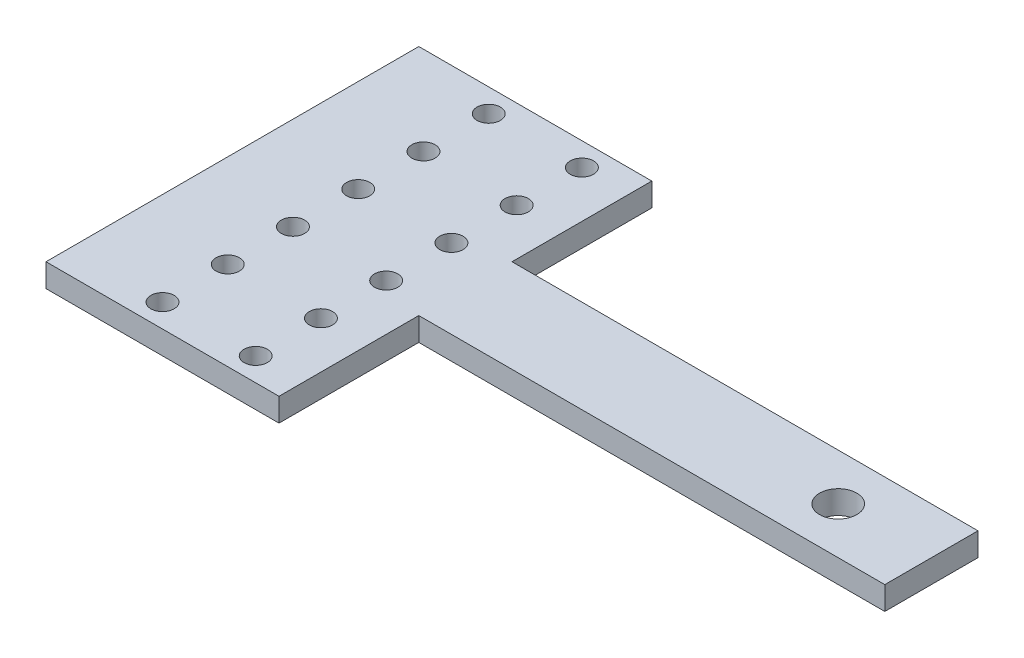
ISO-10303-21;
HEADER;
FILE_DESCRIPTION(('STEP AP214'),'2;1');
FILE_NAME('part.step','',(''),(''),'','','');
FILE_SCHEMA(('AUTOMOTIVE_DESIGN { 1 0 10303 214 1 1 1 1 }'));
ENDSEC;
DATA;
#1=APPLICATION_CONTEXT('core data for automotive mechanical design processes');
#2=APPLICATION_PROTOCOL_DEFINITION('international standard','automotive_design',2000,#1);
#3=PRODUCT_CONTEXT('',#1,'mechanical');
#4=PRODUCT('Part','Part','',(#3));
#5=PRODUCT_RELATED_PRODUCT_CATEGORY('part','',(#4));
#6=PRODUCT_DEFINITION_FORMATION('','',#4);
#7=PRODUCT_DEFINITION_CONTEXT('part definition',#1,'design');
#8=PRODUCT_DEFINITION('design','',#6,#7);
#9=PRODUCT_DEFINITION_SHAPE('','',#8);
#10=(LENGTH_UNIT() NAMED_UNIT(*) SI_UNIT(.MILLI.,.METRE.));
#11=(NAMED_UNIT(*) PLANE_ANGLE_UNIT() SI_UNIT($,.RADIAN.));
#12=(NAMED_UNIT(*) SI_UNIT($,.STERADIAN.) SOLID_ANGLE_UNIT());
#13=UNCERTAINTY_MEASURE_WITH_UNIT(LENGTH_MEASURE(1.E-05),#10,'distance_accuracy_value','');
#14=(GEOMETRIC_REPRESENTATION_CONTEXT(3) GLOBAL_UNCERTAINTY_ASSIGNED_CONTEXT((#13)) GLOBAL_UNIT_ASSIGNED_CONTEXT((#10,
#11,#12)) REPRESENTATION_CONTEXT('',''));
#15=CARTESIAN_POINT('',(0.,0.,0.));
#16=DIRECTION('',(0.,0.,1.));
#17=DIRECTION('',(1.,0.,0.));
#18=AXIS2_PLACEMENT_3D('',#15,#16,#17);
#19=CARTESIAN_POINT('',(25.,2.5,-20.));
#20=DIRECTION('',(-1.,0.,0.));
#21=DIRECTION('',(0.,0.,1.));
#22=AXIS2_PLACEMENT_3D('',#19,#20,#21);
#23=PLANE('',#22);
#24=DIRECTION('',(0.,0.,-1.));
#25=VECTOR('',#24,1.);
#26=CARTESIAN_POINT('',(25.,0.,-20.));
#27=LINE('',#26,#25);
#28=CARTESIAN_POINT('',(25.,0.,-5.00000000000001));
#29=VERTEX_POINT('',#28);
#30=CARTESIAN_POINT('',(25.,0.,-20.));
#31=VERTEX_POINT('',#30);
#32=EDGE_CURVE('E130',#29,#31,#27,.T.);
#33=ORIENTED_EDGE('',*,*,#32,.T.);
#34=DIRECTION('',(0.,-1.,0.));
#35=VECTOR('',#34,1.);
#36=CARTESIAN_POINT('',(25.,2.5,-20.));
#37=LINE('',#36,#35);
#38=CARTESIAN_POINT('',(25.,2.5,-20.));
#39=VERTEX_POINT('',#38);
#40=EDGE_CURVE('E11',#39,#31,#37,.T.);
#41=ORIENTED_EDGE('',*,*,#40,.F.);
#42=DIRECTION('',(0.,0.,-1.));
#43=VECTOR('',#42,1.);
#44=CARTESIAN_POINT('',(25.,2.5,-20.));
#45=LINE('',#44,#43);
#46=CARTESIAN_POINT('',(25.,2.5,-5.00000000000001));
#47=VERTEX_POINT('',#46);
#48=EDGE_CURVE('E145',#47,#39,#45,.T.);
#49=ORIENTED_EDGE('',*,*,#48,.F.);
#50=DIRECTION('',(0.,-1.,0.));
#51=VECTOR('',#50,1.);
#52=CARTESIAN_POINT('',(25.,2.5,-5.00000000000001));
#53=LINE('',#52,#51);
#54=EDGE_CURVE('E126',#47,#29,#53,.T.);
#55=ORIENTED_EDGE('',*,*,#54,.T.);
#56=EDGE_LOOP('',(#33,#41,#49,#55));
#57=FACE_BOUND('',#56,.T.);
#58=ADVANCED_FACE('F34',(#57),#23,.F.);
#59=CARTESIAN_POINT('',(0.,2.5,-20.));
#60=DIRECTION('',(0.,0.,1.));
#61=DIRECTION('',(1.,0.,0.));
#62=AXIS2_PLACEMENT_3D('',#59,#60,#61);
#63=PLANE('',#62);
#64=DIRECTION('',(-1.,0.,0.));
#65=VECTOR('',#64,1.);
#66=CARTESIAN_POINT('',(0.,0.,-20.));
#67=LINE('',#66,#65);
#68=CARTESIAN_POINT('',(0.,0.,-20.));
#69=VERTEX_POINT('',#68);
#70=EDGE_CURVE('E133',#31,#69,#67,.T.);
#71=ORIENTED_EDGE('',*,*,#70,.T.);
#72=DIRECTION('',(0.,-1.,0.));
#73=VECTOR('',#72,1.);
#74=CARTESIAN_POINT('',(0.,2.5,-20.));
#75=LINE('',#74,#73);
#76=CARTESIAN_POINT('',(0.,2.5,-20.));
#77=VERTEX_POINT('',#76);
#78=EDGE_CURVE('E42',#77,#69,#75,.T.);
#79=ORIENTED_EDGE('',*,*,#78,.F.);
#80=DIRECTION('',(-1.,0.,0.));
#81=VECTOR('',#80,1.);
#82=CARTESIAN_POINT('',(0.,2.5,-20.));
#83=LINE('',#82,#81);
#84=EDGE_CURVE('E93',#39,#77,#83,.T.);
#85=ORIENTED_EDGE('',*,*,#84,.F.);
#86=ORIENTED_EDGE('',*,*,#40,.T.);
#87=EDGE_LOOP('',(#71,#79,#85,#86));
#88=FACE_BOUND('',#87,.T.);
#89=ADVANCED_FACE('F272',(#88),#63,.F.);
#90=CARTESIAN_POINT('',(0.,2.5,20.));
#91=DIRECTION('',(1.,0.,0.));
#92=DIRECTION('',(0.,0.,-1.));
#93=AXIS2_PLACEMENT_3D('',#90,#91,#92);
#94=PLANE('',#93);
#95=DIRECTION('',(0.,0.,1.));
#96=VECTOR('',#95,1.);
#97=CARTESIAN_POINT('',(0.,0.,20.));
#98=LINE('',#97,#96);
#99=CARTESIAN_POINT('',(0.,0.,20.));
#100=VERTEX_POINT('',#99);
#101=EDGE_CURVE('E136',#69,#100,#98,.T.);
#102=ORIENTED_EDGE('',*,*,#101,.T.);
#103=DIRECTION('',(0.,-1.,0.));
#104=VECTOR('',#103,1.);
#105=CARTESIAN_POINT('',(0.,2.5,20.));
#106=LINE('',#105,#104);
#107=CARTESIAN_POINT('',(0.,2.5,20.));
#108=VERTEX_POINT('',#107);
#109=EDGE_CURVE('E152',#108,#100,#106,.T.);
#110=ORIENTED_EDGE('',*,*,#109,.F.);
#111=DIRECTION('',(0.,0.,1.));
#112=VECTOR('',#111,1.);
#113=CARTESIAN_POINT('',(0.,2.5,20.));
#114=LINE('',#113,#112);
#115=EDGE_CURVE('E160',#77,#108,#114,.T.);
#116=ORIENTED_EDGE('',*,*,#115,.F.);
#117=ORIENTED_EDGE('',*,*,#78,.T.);
#118=EDGE_LOOP('',(#102,#110,#116,#117));
#119=FACE_BOUND('',#118,.T.);
#120=ADVANCED_FACE('F158',(#119),#94,.F.);
#121=CARTESIAN_POINT('',(25.,2.5,20.));
#122=DIRECTION('',(0.,0.,-1.));
#123=DIRECTION('',(-1.,0.,0.));
#124=AXIS2_PLACEMENT_3D('',#121,#122,#123);
#125=PLANE('',#124);
#126=DIRECTION('',(1.,0.,0.));
#127=VECTOR('',#126,1.);
#128=CARTESIAN_POINT('',(25.,0.,20.));
#129=LINE('',#128,#127);
#130=CARTESIAN_POINT('',(25.,0.,20.));
#131=VERTEX_POINT('',#130);
#132=EDGE_CURVE('E138',#100,#131,#129,.T.);
#133=ORIENTED_EDGE('',*,*,#132,.T.);
#134=DIRECTION('',(0.,-1.,0.));
#135=VECTOR('',#134,1.);
#136=CARTESIAN_POINT('',(25.,2.5,20.));
#137=LINE('',#136,#135);
#138=CARTESIAN_POINT('',(25.,2.5,20.));
#139=VERTEX_POINT('',#138);
#140=EDGE_CURVE('E149',#139,#131,#137,.T.);
#141=ORIENTED_EDGE('',*,*,#140,.F.);
#142=DIRECTION('',(1.,0.,0.));
#143=VECTOR('',#142,1.);
#144=CARTESIAN_POINT('',(25.,2.5,20.));
#145=LINE('',#144,#143);
#146=EDGE_CURVE('E172',#108,#139,#145,.T.);
#147=ORIENTED_EDGE('',*,*,#146,.F.);
#148=ORIENTED_EDGE('',*,*,#109,.T.);
#149=EDGE_LOOP('',(#133,#141,#147,#148));
#150=FACE_BOUND('',#149,.T.);
#151=ADVANCED_FACE('F168',(#150),#125,.F.);
#152=CARTESIAN_POINT('',(25.,2.5,4.99999999999999));
#153=DIRECTION('',(-1.,0.,0.));
#154=DIRECTION('',(0.,0.,1.));
#155=AXIS2_PLACEMENT_3D('',#152,#153,#154);
#156=PLANE('',#155);
#157=DIRECTION('',(0.,0.,-1.));
#158=VECTOR('',#157,1.);
#159=CARTESIAN_POINT('',(25.,0.,4.99999999999999));
#160=LINE('',#159,#158);
#161=CARTESIAN_POINT('',(25.,0.,4.99999999999999));
#162=VERTEX_POINT('',#161);
#163=EDGE_CURVE('E140',#131,#162,#160,.T.);
#164=ORIENTED_EDGE('',*,*,#163,.T.);
#165=DIRECTION('',(0.,-1.,0.));
#166=VECTOR('',#165,1.);
#167=CARTESIAN_POINT('',(25.,2.5,4.99999999999999));
#168=LINE('',#167,#166);
#169=CARTESIAN_POINT('',(25.,2.5,4.99999999999999));
#170=VERTEX_POINT('',#169);
#171=EDGE_CURVE('E121',#170,#162,#168,.T.);
#172=ORIENTED_EDGE('',*,*,#171,.F.);
#173=DIRECTION('',(0.,0.,-1.));
#174=VECTOR('',#173,1.);
#175=CARTESIAN_POINT('',(25.,2.5,4.99999999999999));
#176=LINE('',#175,#174);
#177=EDGE_CURVE('E112',#139,#170,#176,.T.);
#178=ORIENTED_EDGE('',*,*,#177,.F.);
#179=ORIENTED_EDGE('',*,*,#140,.T.);
#180=EDGE_LOOP('',(#164,#172,#178,#179));
#181=FACE_BOUND('',#180,.T.);
#182=ADVANCED_FACE('F171',(#181),#156,.F.);
#183=CARTESIAN_POINT('',(75.,2.5,4.99999999999999));
#184=DIRECTION('',(0.,0.,-1.));
#185=DIRECTION('',(-1.,0.,0.));
#186=AXIS2_PLACEMENT_3D('',#183,#184,#185);
#187=PLANE('',#186);
#188=DIRECTION('',(1.,0.,0.));
#189=VECTOR('',#188,1.);
#190=CARTESIAN_POINT('',(75.,0.,4.99999999999999));
#191=LINE('',#190,#189);
#192=CARTESIAN_POINT('',(75.,0.,4.99999999999999));
#193=VERTEX_POINT('',#192);
#194=EDGE_CURVE('E120',#162,#193,#191,.T.);
#195=ORIENTED_EDGE('',*,*,#194,.T.);
#196=DIRECTION('',(0.,-1.,0.));
#197=VECTOR('',#196,1.);
#198=CARTESIAN_POINT('',(75.,2.5,4.99999999999999));
#199=LINE('',#198,#197);
#200=CARTESIAN_POINT('',(75.,2.5,4.99999999999999));
#201=VERTEX_POINT('',#200);
#202=EDGE_CURVE('E117',#201,#193,#199,.T.);
#203=ORIENTED_EDGE('',*,*,#202,.F.);
#204=DIRECTION('',(1.,0.,0.));
#205=VECTOR('',#204,1.);
#206=CARTESIAN_POINT('',(75.,2.5,4.99999999999999));
#207=LINE('',#206,#205);
#208=EDGE_CURVE('E106',#170,#201,#207,.T.);
#209=ORIENTED_EDGE('',*,*,#208,.F.);
#210=ORIENTED_EDGE('',*,*,#171,.T.);
#211=EDGE_LOOP('',(#195,#203,#209,#210));
#212=FACE_BOUND('',#211,.T.);
#213=ADVANCED_FACE('F118',(#212),#187,.F.);
#214=CARTESIAN_POINT('',(75.,2.5,-5.00000000000001));
#215=DIRECTION('',(-1.,0.,0.));
#216=DIRECTION('',(0.,0.,1.));
#217=AXIS2_PLACEMENT_3D('',#214,#215,#216);
#218=PLANE('',#217);
#219=DIRECTION('',(0.,0.,-1.));
#220=VECTOR('',#219,1.);
#221=CARTESIAN_POINT('',(75.,0.,-5.00000000000001));
#222=LINE('',#221,#220);
#223=CARTESIAN_POINT('',(75.,0.,-5.00000000000001));
#224=VERTEX_POINT('',#223);
#225=EDGE_CURVE('E79',#193,#224,#222,.T.);
#226=ORIENTED_EDGE('',*,*,#225,.T.);
#227=DIRECTION('',(0.,-1.,0.));
#228=VECTOR('',#227,1.);
#229=CARTESIAN_POINT('',(75.,2.5,-5.00000000000001));
#230=LINE('',#229,#228);
#231=CARTESIAN_POINT('',(75.,2.5,-5.00000000000001));
#232=VERTEX_POINT('',#231);
#233=EDGE_CURVE('E122',#232,#224,#230,.T.);
#234=ORIENTED_EDGE('',*,*,#233,.F.);
#235=DIRECTION('',(0.,0.,-1.));
#236=VECTOR('',#235,1.);
#237=CARTESIAN_POINT('',(75.,2.5,-5.00000000000001));
#238=LINE('',#237,#236);
#239=EDGE_CURVE('E110',#201,#232,#238,.T.);
#240=ORIENTED_EDGE('',*,*,#239,.F.);
#241=ORIENTED_EDGE('',*,*,#202,.T.);
#242=EDGE_LOOP('',(#226,#234,#240,#241));
#243=FACE_BOUND('',#242,.T.);
#244=ADVANCED_FACE('F124',(#243),#218,.F.);
#245=CARTESIAN_POINT('',(25.,2.5,-5.00000000000001));
#246=DIRECTION('',(0.,0.,1.));
#247=DIRECTION('',(1.,0.,0.));
#248=AXIS2_PLACEMENT_3D('',#245,#246,#247);
#249=PLANE('',#248);
#250=DIRECTION('',(-1.,0.,0.));
#251=VECTOR('',#250,1.);
#252=CARTESIAN_POINT('',(25.,0.,-5.00000000000001));
#253=LINE('',#252,#251);
#254=EDGE_CURVE('E85',#224,#29,#253,.T.);
#255=ORIENTED_EDGE('',*,*,#254,.T.);
#256=ORIENTED_EDGE('',*,*,#54,.F.);
#257=DIRECTION('',(-1.,0.,0.));
#258=VECTOR('',#257,1.);
#259=CARTESIAN_POINT('',(25.,2.5,-5.00000000000001));
#260=LINE('',#259,#258);
#261=EDGE_CURVE('E50',#232,#47,#260,.T.);
#262=ORIENTED_EDGE('',*,*,#261,.F.);
#263=ORIENTED_EDGE('',*,*,#233,.T.);
#264=EDGE_LOOP('',(#255,#256,#262,#263));
#265=FACE_BOUND('',#264,.T.);
#266=ADVANCED_FACE('F279',(#265),#249,.F.);
#267=CARTESIAN_POINT('',(0.,2.5,0.));
#268=DIRECTION('',(0.,1.,0.));
#269=DIRECTION('',(0.,0.,1.));
#270=AXIS2_PLACEMENT_3D('',#267,#268,#269);
#271=PLANE('',#270);
#272=CARTESIAN_POINT('',(65.,2.5,0.));
#273=DIRECTION('',(0.,1.,0.));
#274=DIRECTION('',(0.,0.,1.));
#275=AXIS2_PLACEMENT_3D('',#272,#273,#274);
#276=CIRCLE('',#275,2.);
#277=CARTESIAN_POINT('',(65.,2.5,2.));
#278=VERTEX_POINT('',#277);
#279=EDGE_CURVE('E236',#278,#278,#276,.F.);
#280=ORIENTED_EDGE('',*,*,#279,.T.);
#281=EDGE_LOOP('',(#280));
#282=FACE_BOUND('',#281,.T.);
#283=CARTESIAN_POINT('',(10.0000000000001,2.5,-3.5));
#284=DIRECTION('',(0.,1.,0.));
#285=DIRECTION('',(0.,0.,1.));
#286=AXIS2_PLACEMENT_3D('',#283,#284,#285);
#287=CIRCLE('',#286,1.25);
#288=CARTESIAN_POINT('',(10.0000000000001,2.5,-2.25));
#289=VERTEX_POINT('',#288);
#290=EDGE_CURVE('E211',#289,#289,#287,.T.);
#291=ORIENTED_EDGE('',*,*,#290,.F.);
#292=EDGE_LOOP('',(#291));
#293=FACE_BOUND('',#292,.T.);
#294=CARTESIAN_POINT('',(10.0000000000001,2.5,-10.5));
#295=DIRECTION('',(0.,1.,0.));
#296=DIRECTION('',(0.,0.,1.));
#297=AXIS2_PLACEMENT_3D('',#294,#295,#296);
#298=CIRCLE('',#297,1.25);
#299=CARTESIAN_POINT('',(10.0000000000001,2.5,-9.25));
#300=VERTEX_POINT('',#299);
#301=EDGE_CURVE('E218',#300,#300,#298,.T.);
#302=ORIENTED_EDGE('',*,*,#301,.F.);
#303=EDGE_LOOP('',(#302));
#304=FACE_BOUND('',#303,.T.);
#305=CARTESIAN_POINT('',(20.0000000000004,2.5,17.5));
#306=DIRECTION('',(0.,1.,0.));
#307=DIRECTION('',(0.,0.,1.));
#308=AXIS2_PLACEMENT_3D('',#305,#306,#307);
#309=CIRCLE('',#308,1.25);
#310=CARTESIAN_POINT('',(20.0000000000004,2.5,18.75));
#311=VERTEX_POINT('',#310);
#312=EDGE_CURVE('E224',#311,#311,#309,.T.);
#313=ORIENTED_EDGE('',*,*,#312,.F.);
#314=EDGE_LOOP('',(#313));
#315=FACE_BOUND('',#314,.T.);
#316=CARTESIAN_POINT('',(20.0000000000003,2.5,10.5));
#317=DIRECTION('',(0.,1.,0.));
#318=DIRECTION('',(0.,0.,1.));
#319=AXIS2_PLACEMENT_3D('',#316,#317,#318);
#320=CIRCLE('',#319,1.25);
#321=CARTESIAN_POINT('',(20.0000000000003,2.5,11.75));
#322=VERTEX_POINT('',#321);
#323=EDGE_CURVE('E188',#322,#322,#320,.T.);
#324=ORIENTED_EDGE('',*,*,#323,.F.);
#325=EDGE_LOOP('',(#324));
#326=FACE_BOUND('',#325,.T.);
#327=CARTESIAN_POINT('',(20.0000000000002,2.5,3.5));
#328=DIRECTION('',(0.,1.,0.));
#329=DIRECTION('',(0.,0.,1.));
#330=AXIS2_PLACEMENT_3D('',#327,#328,#329);
#331=CIRCLE('',#330,1.25);
#332=CARTESIAN_POINT('',(20.0000000000002,2.5,4.74999999999999));
#333=VERTEX_POINT('',#332);
#334=EDGE_CURVE('E187',#333,#333,#331,.T.);
#335=ORIENTED_EDGE('',*,*,#334,.F.);
#336=EDGE_LOOP('',(#335));
#337=FACE_BOUND('',#336,.T.);
#338=CARTESIAN_POINT('',(20.0000000000001,2.5,-3.5));
#339=DIRECTION('',(0.,1.,0.));
#340=DIRECTION('',(0.,0.,1.));
#341=AXIS2_PLACEMENT_3D('',#338,#339,#340);
#342=CIRCLE('',#341,1.25);
#343=CARTESIAN_POINT('',(20.0000000000001,2.5,-2.25000000000001));
#344=VERTEX_POINT('',#343);
#345=EDGE_CURVE('E194',#344,#344,#342,.T.);
#346=ORIENTED_EDGE('',*,*,#345,.F.);
#347=EDGE_LOOP('',(#346));
#348=FACE_BOUND('',#347,.T.);
#349=CARTESIAN_POINT('',(20.0000000000001,2.5,-10.5));
#350=DIRECTION('',(0.,1.,0.));
#351=DIRECTION('',(0.,0.,1.));
#352=AXIS2_PLACEMENT_3D('',#349,#350,#351);
#353=CIRCLE('',#352,1.25);
#354=CARTESIAN_POINT('',(20.0000000000001,2.5,-9.25000000000001));
#355=VERTEX_POINT('',#354);
#356=EDGE_CURVE('E200',#355,#355,#353,.T.);
#357=ORIENTED_EDGE('',*,*,#356,.F.);
#358=EDGE_LOOP('',(#357));
#359=FACE_BOUND('',#358,.T.);
#360=CARTESIAN_POINT('',(20.,2.5,-17.5));
#361=DIRECTION('',(0.,1.,0.));
#362=DIRECTION('',(0.,0.,1.));
#363=AXIS2_PLACEMENT_3D('',#360,#361,#362);
#364=CIRCLE('',#363,1.25);
#365=CARTESIAN_POINT('',(20.,2.5,-16.25));
#366=VERTEX_POINT('',#365);
#367=EDGE_CURVE('E181',#366,#366,#364,.T.);
#368=ORIENTED_EDGE('',*,*,#367,.F.);
#369=EDGE_LOOP('',(#368));
#370=FACE_BOUND('',#369,.T.);
#371=CARTESIAN_POINT('',(10.0000000000002,2.5,3.5));
#372=DIRECTION('',(0.,1.,0.));
#373=DIRECTION('',(0.,0.,1.));
#374=AXIS2_PLACEMENT_3D('',#371,#372,#373);
#375=CIRCLE('',#374,1.25);
#376=CARTESIAN_POINT('',(10.0000000000002,2.5,4.75));
#377=VERTEX_POINT('',#376);
#378=EDGE_CURVE('E212',#377,#377,#375,.T.);
#379=ORIENTED_EDGE('',*,*,#378,.F.);
#380=EDGE_LOOP('',(#379));
#381=FACE_BOUND('',#380,.T.);
#382=CARTESIAN_POINT('',(10.0000000000003,2.5,10.5));
#383=DIRECTION('',(0.,1.,0.));
#384=DIRECTION('',(0.,0.,1.));
#385=AXIS2_PLACEMENT_3D('',#382,#383,#384);
#386=CIRCLE('',#385,1.25);
#387=CARTESIAN_POINT('',(10.0000000000003,2.5,11.75));
#388=VERTEX_POINT('',#387);
#389=EDGE_CURVE('E242',#388,#388,#386,.T.);
#390=ORIENTED_EDGE('',*,*,#389,.F.);
#391=EDGE_LOOP('',(#390));
#392=FACE_BOUND('',#391,.T.);
#393=CARTESIAN_POINT('',(10.0000000000004,2.5,17.5));
#394=DIRECTION('',(0.,1.,0.));
#395=DIRECTION('',(0.,0.,1.));
#396=AXIS2_PLACEMENT_3D('',#393,#394,#395);
#397=CIRCLE('',#396,1.25);
#398=CARTESIAN_POINT('',(10.0000000000004,2.5,18.75));
#399=VERTEX_POINT('',#398);
#400=EDGE_CURVE('E235',#399,#399,#397,.T.);
#401=ORIENTED_EDGE('',*,*,#400,.F.);
#402=EDGE_LOOP('',(#401));
#403=FACE_BOUND('',#402,.T.);
#404=CARTESIAN_POINT('',(9.99999999999999,2.5,-17.5));
#405=DIRECTION('',(0.,1.,0.));
#406=DIRECTION('',(0.,0.,1.));
#407=AXIS2_PLACEMENT_3D('',#404,#405,#406);
#408=CIRCLE('',#407,1.25);
#409=CARTESIAN_POINT('',(9.99999999999999,2.5,-16.25));
#410=VERTEX_POINT('',#409);
#411=EDGE_CURVE('E134',#410,#410,#408,.T.);
#412=ORIENTED_EDGE('',*,*,#411,.F.);
#413=EDGE_LOOP('',(#412));
#414=FACE_BOUND('',#413,.T.);
#415=ORIENTED_EDGE('',*,*,#48,.T.);
#416=ORIENTED_EDGE('',*,*,#84,.T.);
#417=ORIENTED_EDGE('',*,*,#115,.T.);
#418=ORIENTED_EDGE('',*,*,#146,.T.);
#419=ORIENTED_EDGE('',*,*,#177,.T.);
#420=ORIENTED_EDGE('',*,*,#208,.T.);
#421=ORIENTED_EDGE('',*,*,#239,.T.);
#422=ORIENTED_EDGE('',*,*,#261,.T.);
#423=EDGE_LOOP('',(#415,#416,#417,#418,#419,#420,#421,#422));
#424=FACE_BOUND('',#423,.T.);
#425=ADVANCED_FACE('F108',(#282,#293,#304,#315,#326,#337,#348,#359,#370,#381,#392,#403,#414,
#424),#271,.T.);
#426=CARTESIAN_POINT('',(0.,0.,0.));
#427=DIRECTION('',(0.,1.,0.));
#428=DIRECTION('',(0.,0.,1.));
#429=AXIS2_PLACEMENT_3D('',#426,#427,#428);
#430=PLANE('',#429);
#431=CARTESIAN_POINT('',(65.,0.,0.));
#432=DIRECTION('',(0.,1.,0.));
#433=DIRECTION('',(0.,0.,1.));
#434=AXIS2_PLACEMENT_3D('',#431,#432,#433);
#435=CIRCLE('',#434,2.);
#436=CARTESIAN_POINT('',(65.,0.,2.));
#437=VERTEX_POINT('',#436);
#438=EDGE_CURVE('E252',#437,#437,#435,.T.);
#439=ORIENTED_EDGE('',*,*,#438,.T.);
#440=EDGE_LOOP('',(#439));
#441=FACE_BOUND('',#440,.T.);
#442=CARTESIAN_POINT('',(10.0000000000001,0.,-3.5));
#443=DIRECTION('',(0.,1.,0.));
#444=DIRECTION('',(0.,0.,1.));
#445=AXIS2_PLACEMENT_3D('',#442,#443,#444);
#446=CIRCLE('',#445,1.25);
#447=CARTESIAN_POINT('',(10.0000000000001,0.,-2.25));
#448=VERTEX_POINT('',#447);
#449=EDGE_CURVE('E208',#448,#448,#446,.T.);
#450=ORIENTED_EDGE('',*,*,#449,.T.);
#451=EDGE_LOOP('',(#450));
#452=FACE_BOUND('',#451,.T.);
#453=CARTESIAN_POINT('',(10.0000000000001,0.,-10.5));
#454=DIRECTION('',(0.,1.,0.));
#455=DIRECTION('',(0.,0.,1.));
#456=AXIS2_PLACEMENT_3D('',#453,#454,#455);
#457=CIRCLE('',#456,1.25);
#458=CARTESIAN_POINT('',(10.0000000000001,0.,-9.25));
#459=VERTEX_POINT('',#458);
#460=EDGE_CURVE('E215',#459,#459,#457,.T.);
#461=ORIENTED_EDGE('',*,*,#460,.T.);
#462=EDGE_LOOP('',(#461));
#463=FACE_BOUND('',#462,.T.);
#464=CARTESIAN_POINT('',(20.0000000000004,0.,17.5));
#465=DIRECTION('',(0.,1.,0.));
#466=DIRECTION('',(0.,0.,1.));
#467=AXIS2_PLACEMENT_3D('',#464,#465,#466);
#468=CIRCLE('',#467,1.25);
#469=CARTESIAN_POINT('',(20.0000000000004,0.,18.75));
#470=VERTEX_POINT('',#469);
#471=EDGE_CURVE('E221',#470,#470,#468,.T.);
#472=ORIENTED_EDGE('',*,*,#471,.T.);
#473=EDGE_LOOP('',(#472));
#474=FACE_BOUND('',#473,.T.);
#475=CARTESIAN_POINT('',(20.0000000000003,0.,10.5));
#476=DIRECTION('',(0.,1.,0.));
#477=DIRECTION('',(0.,0.,1.));
#478=AXIS2_PLACEMENT_3D('',#475,#476,#477);
#479=CIRCLE('',#478,1.25);
#480=CARTESIAN_POINT('',(20.0000000000003,0.,11.75));
#481=VERTEX_POINT('',#480);
#482=EDGE_CURVE('E227',#481,#481,#479,.T.);
#483=ORIENTED_EDGE('',*,*,#482,.T.);
#484=EDGE_LOOP('',(#483));
#485=FACE_BOUND('',#484,.T.);
#486=CARTESIAN_POINT('',(20.0000000000002,0.,3.5));
#487=DIRECTION('',(0.,1.,0.));
#488=DIRECTION('',(0.,0.,1.));
#489=AXIS2_PLACEMENT_3D('',#486,#487,#488);
#490=CIRCLE('',#489,1.25);
#491=CARTESIAN_POINT('',(20.0000000000002,0.,4.74999999999999));
#492=VERTEX_POINT('',#491);
#493=EDGE_CURVE('E184',#492,#492,#490,.T.);
#494=ORIENTED_EDGE('',*,*,#493,.T.);
#495=EDGE_LOOP('',(#494));
#496=FACE_BOUND('',#495,.T.);
#497=CARTESIAN_POINT('',(20.0000000000001,0.,-3.5));
#498=DIRECTION('',(0.,1.,0.));
#499=DIRECTION('',(0.,0.,1.));
#500=AXIS2_PLACEMENT_3D('',#497,#498,#499);
#501=CIRCLE('',#500,1.25);
#502=CARTESIAN_POINT('',(20.0000000000001,0.,-2.25000000000001));
#503=VERTEX_POINT('',#502);
#504=EDGE_CURVE('E191',#503,#503,#501,.T.);
#505=ORIENTED_EDGE('',*,*,#504,.T.);
#506=EDGE_LOOP('',(#505));
#507=FACE_BOUND('',#506,.T.);
#508=CARTESIAN_POINT('',(20.0000000000001,0.,-10.5));
#509=DIRECTION('',(0.,1.,0.));
#510=DIRECTION('',(0.,0.,1.));
#511=AXIS2_PLACEMENT_3D('',#508,#509,#510);
#512=CIRCLE('',#511,1.25);
#513=CARTESIAN_POINT('',(20.0000000000001,0.,-9.25000000000001));
#514=VERTEX_POINT('',#513);
#515=EDGE_CURVE('E197',#514,#514,#512,.T.);
#516=ORIENTED_EDGE('',*,*,#515,.T.);
#517=EDGE_LOOP('',(#516));
#518=FACE_BOUND('',#517,.T.);
#519=CARTESIAN_POINT('',(20.,0.,-17.5));
#520=DIRECTION('',(0.,1.,0.));
#521=DIRECTION('',(0.,0.,1.));
#522=AXIS2_PLACEMENT_3D('',#519,#520,#521);
#523=CIRCLE('',#522,1.25);
#524=CARTESIAN_POINT('',(20.,0.,-16.25));
#525=VERTEX_POINT('',#524);
#526=EDGE_CURVE('E203',#525,#525,#523,.T.);
#527=ORIENTED_EDGE('',*,*,#526,.T.);
#528=EDGE_LOOP('',(#527));
#529=FACE_BOUND('',#528,.T.);
#530=CARTESIAN_POINT('',(10.0000000000002,0.,3.5));
#531=DIRECTION('',(0.,1.,0.));
#532=DIRECTION('',(0.,0.,1.));
#533=AXIS2_PLACEMENT_3D('',#530,#531,#532);
#534=CIRCLE('',#533,1.25);
#535=CARTESIAN_POINT('',(10.0000000000002,0.,4.75));
#536=VERTEX_POINT('',#535);
#537=EDGE_CURVE('E245',#536,#536,#534,.T.);
#538=ORIENTED_EDGE('',*,*,#537,.T.);
#539=EDGE_LOOP('',(#538));
#540=FACE_BOUND('',#539,.T.);
#541=CARTESIAN_POINT('',(10.0000000000003,0.,10.5));
#542=DIRECTION('',(0.,1.,0.));
#543=DIRECTION('',(0.,0.,1.));
#544=AXIS2_PLACEMENT_3D('',#541,#542,#543);
#545=CIRCLE('',#544,1.25);
#546=CARTESIAN_POINT('',(10.0000000000003,0.,11.75));
#547=VERTEX_POINT('',#546);
#548=EDGE_CURVE('E239',#547,#547,#545,.T.);
#549=ORIENTED_EDGE('',*,*,#548,.T.);
#550=EDGE_LOOP('',(#549));
#551=FACE_BOUND('',#550,.T.);
#552=CARTESIAN_POINT('',(10.0000000000004,0.,17.5));
#553=DIRECTION('',(0.,1.,0.));
#554=DIRECTION('',(0.,0.,1.));
#555=AXIS2_PLACEMENT_3D('',#552,#553,#554);
#556=CIRCLE('',#555,1.25);
#557=CARTESIAN_POINT('',(10.0000000000004,0.,18.75));
#558=VERTEX_POINT('',#557);
#559=EDGE_CURVE('E232',#558,#558,#556,.T.);
#560=ORIENTED_EDGE('',*,*,#559,.T.);
#561=EDGE_LOOP('',(#560));
#562=FACE_BOUND('',#561,.T.);
#563=CARTESIAN_POINT('',(9.99999999999999,0.,-17.5));
#564=DIRECTION('',(0.,1.,0.));
#565=DIRECTION('',(0.,0.,1.));
#566=AXIS2_PLACEMENT_3D('',#563,#564,#565);
#567=CIRCLE('',#566,1.25);
#568=CARTESIAN_POINT('',(9.99999999999999,0.,-16.25));
#569=VERTEX_POINT('',#568);
#570=EDGE_CURVE('E178',#569,#569,#567,.T.);
#571=ORIENTED_EDGE('',*,*,#570,.T.);
#572=EDGE_LOOP('',(#571));
#573=FACE_BOUND('',#572,.T.);
#574=ORIENTED_EDGE('',*,*,#32,.F.);
#575=ORIENTED_EDGE('',*,*,#254,.F.);
#576=ORIENTED_EDGE('',*,*,#225,.F.);
#577=ORIENTED_EDGE('',*,*,#194,.F.);
#578=ORIENTED_EDGE('',*,*,#163,.F.);
#579=ORIENTED_EDGE('',*,*,#132,.F.);
#580=ORIENTED_EDGE('',*,*,#101,.F.);
#581=ORIENTED_EDGE('',*,*,#70,.F.);
#582=EDGE_LOOP('',(#574,#575,#576,#577,#578,#579,#580,#581));
#583=FACE_BOUND('',#582,.T.);
#584=ADVANCED_FACE('F164',(#441,#452,#463,#474,#485,#496,#507,#518,#529,#540,#551,#562,#573,
#583),#430,.F.);
#585=CARTESIAN_POINT('',(9.99999999999999,2.5,-17.5));
#586=DIRECTION('',(0.,-1.,0.));
#587=DIRECTION('',(0.,0.,-1.));
#588=AXIS2_PLACEMENT_3D('',#585,#586,#587);
#589=CYLINDRICAL_SURFACE('',#588,1.25);
#590=ORIENTED_EDGE('',*,*,#411,.T.);
#591=EDGE_LOOP('',(#590));
#592=FACE_BOUND('',#591,.T.);
#593=ORIENTED_EDGE('',*,*,#570,.F.);
#594=EDGE_LOOP('',(#593));
#595=FACE_BOUND('',#594,.T.);
#596=ADVANCED_FACE('F328',(#592,#595),#589,.F.);
#597=CARTESIAN_POINT('',(10.0000000000004,2.5,17.5));
#598=DIRECTION('',(0.,-1.,0.));
#599=DIRECTION('',(0.,0.,-1.));
#600=AXIS2_PLACEMENT_3D('',#597,#598,#599);
#601=CYLINDRICAL_SURFACE('',#600,1.25);
#602=ORIENTED_EDGE('',*,*,#400,.T.);
#603=EDGE_LOOP('',(#602));
#604=FACE_BOUND('',#603,.T.);
#605=ORIENTED_EDGE('',*,*,#559,.F.);
#606=EDGE_LOOP('',(#605));
#607=FACE_BOUND('',#606,.T.);
#608=ADVANCED_FACE('F333',(#604,#607),#601,.F.);
#609=CARTESIAN_POINT('',(10.0000000000003,2.5,10.5));
#610=DIRECTION('',(0.,-1.,0.));
#611=DIRECTION('',(0.,0.,-1.));
#612=AXIS2_PLACEMENT_3D('',#609,#610,#611);
#613=CYLINDRICAL_SURFACE('',#612,1.25);
#614=ORIENTED_EDGE('',*,*,#389,.T.);
#615=EDGE_LOOP('',(#614));
#616=FACE_BOUND('',#615,.T.);
#617=ORIENTED_EDGE('',*,*,#548,.F.);
#618=EDGE_LOOP('',(#617));
#619=FACE_BOUND('',#618,.T.);
#620=ADVANCED_FACE('F345',(#616,#619),#613,.F.);
#621=CARTESIAN_POINT('',(10.0000000000002,2.5,3.5));
#622=DIRECTION('',(0.,-1.,0.));
#623=DIRECTION('',(0.,0.,-1.));
#624=AXIS2_PLACEMENT_3D('',#621,#622,#623);
#625=CYLINDRICAL_SURFACE('',#624,1.25);
#626=ORIENTED_EDGE('',*,*,#378,.T.);
#627=EDGE_LOOP('',(#626));
#628=FACE_BOUND('',#627,.T.);
#629=ORIENTED_EDGE('',*,*,#537,.F.);
#630=EDGE_LOOP('',(#629));
#631=FACE_BOUND('',#630,.T.);
#632=ADVANCED_FACE('F355',(#628,#631),#625,.F.);
#633=CARTESIAN_POINT('',(20.,2.5,-17.5));
#634=DIRECTION('',(0.,-1.,0.));
#635=DIRECTION('',(0.,0.,-1.));
#636=AXIS2_PLACEMENT_3D('',#633,#634,#635);
#637=CYLINDRICAL_SURFACE('',#636,1.25);
#638=ORIENTED_EDGE('',*,*,#367,.T.);
#639=EDGE_LOOP('',(#638));
#640=FACE_BOUND('',#639,.T.);
#641=ORIENTED_EDGE('',*,*,#526,.F.);
#642=EDGE_LOOP('',(#641));
#643=FACE_BOUND('',#642,.T.);
#644=ADVANCED_FACE('F365',(#640,#643),#637,.F.);
#645=CARTESIAN_POINT('',(20.0000000000001,2.5,-10.5));
#646=DIRECTION('',(0.,-1.,0.));
#647=DIRECTION('',(0.,0.,-1.));
#648=AXIS2_PLACEMENT_3D('',#645,#646,#647);
#649=CYLINDRICAL_SURFACE('',#648,1.25);
#650=ORIENTED_EDGE('',*,*,#356,.T.);
#651=EDGE_LOOP('',(#650));
#652=FACE_BOUND('',#651,.T.);
#653=ORIENTED_EDGE('',*,*,#515,.F.);
#654=EDGE_LOOP('',(#653));
#655=FACE_BOUND('',#654,.T.);
#656=ADVANCED_FACE('F374',(#652,#655),#649,.F.);
#657=CARTESIAN_POINT('',(20.0000000000001,2.5,-3.5));
#658=DIRECTION('',(0.,-1.,0.));
#659=DIRECTION('',(0.,0.,-1.));
#660=AXIS2_PLACEMENT_3D('',#657,#658,#659);
#661=CYLINDRICAL_SURFACE('',#660,1.25);
#662=ORIENTED_EDGE('',*,*,#345,.T.);
#663=EDGE_LOOP('',(#662));
#664=FACE_BOUND('',#663,.T.);
#665=ORIENTED_EDGE('',*,*,#504,.F.);
#666=EDGE_LOOP('',(#665));
#667=FACE_BOUND('',#666,.T.);
#668=ADVANCED_FACE('F384',(#664,#667),#661,.F.);
#669=CARTESIAN_POINT('',(20.0000000000002,2.5,3.5));
#670=DIRECTION('',(0.,-1.,0.));
#671=DIRECTION('',(0.,0.,-1.));
#672=AXIS2_PLACEMENT_3D('',#669,#670,#671);
#673=CYLINDRICAL_SURFACE('',#672,1.25);
#674=ORIENTED_EDGE('',*,*,#334,.T.);
#675=EDGE_LOOP('',(#674));
#676=FACE_BOUND('',#675,.T.);
#677=ORIENTED_EDGE('',*,*,#493,.F.);
#678=EDGE_LOOP('',(#677));
#679=FACE_BOUND('',#678,.T.);
#680=ADVANCED_FACE('F394',(#676,#679),#673,.F.);
#681=CARTESIAN_POINT('',(20.0000000000003,2.5,10.5));
#682=DIRECTION('',(0.,-1.,0.));
#683=DIRECTION('',(0.,0.,-1.));
#684=AXIS2_PLACEMENT_3D('',#681,#682,#683);
#685=CYLINDRICAL_SURFACE('',#684,1.25);
#686=ORIENTED_EDGE('',*,*,#323,.T.);
#687=EDGE_LOOP('',(#686));
#688=FACE_BOUND('',#687,.T.);
#689=ORIENTED_EDGE('',*,*,#482,.F.);
#690=EDGE_LOOP('',(#689));
#691=FACE_BOUND('',#690,.T.);
#692=ADVANCED_FACE('F404',(#688,#691),#685,.F.);
#693=CARTESIAN_POINT('',(20.0000000000004,2.5,17.5));
#694=DIRECTION('',(0.,-1.,0.));
#695=DIRECTION('',(0.,0.,-1.));
#696=AXIS2_PLACEMENT_3D('',#693,#694,#695);
#697=CYLINDRICAL_SURFACE('',#696,1.25);
#698=ORIENTED_EDGE('',*,*,#312,.T.);
#699=EDGE_LOOP('',(#698));
#700=FACE_BOUND('',#699,.T.);
#701=ORIENTED_EDGE('',*,*,#471,.F.);
#702=EDGE_LOOP('',(#701));
#703=FACE_BOUND('',#702,.T.);
#704=ADVANCED_FACE('F414',(#700,#703),#697,.F.);
#705=CARTESIAN_POINT('',(10.0000000000001,2.5,-10.5));
#706=DIRECTION('',(0.,-1.,0.));
#707=DIRECTION('',(0.,0.,-1.));
#708=AXIS2_PLACEMENT_3D('',#705,#706,#707);
#709=CYLINDRICAL_SURFACE('',#708,1.25);
#710=ORIENTED_EDGE('',*,*,#301,.T.);
#711=EDGE_LOOP('',(#710));
#712=FACE_BOUND('',#711,.T.);
#713=ORIENTED_EDGE('',*,*,#460,.F.);
#714=EDGE_LOOP('',(#713));
#715=FACE_BOUND('',#714,.T.);
#716=ADVANCED_FACE('F266',(#712,#715),#709,.F.);
#717=CARTESIAN_POINT('',(10.0000000000001,2.5,-3.5));
#718=DIRECTION('',(0.,-1.,0.));
#719=DIRECTION('',(0.,0.,-1.));
#720=AXIS2_PLACEMENT_3D('',#717,#718,#719);
#721=CYLINDRICAL_SURFACE('',#720,1.25);
#722=ORIENTED_EDGE('',*,*,#290,.T.);
#723=EDGE_LOOP('',(#722));
#724=FACE_BOUND('',#723,.T.);
#725=ORIENTED_EDGE('',*,*,#449,.F.);
#726=EDGE_LOOP('',(#725));
#727=FACE_BOUND('',#726,.T.);
#728=ADVANCED_FACE('F260',(#724,#727),#721,.F.);
#729=CARTESIAN_POINT('',(65.,10.,0.));
#730=DIRECTION('',(0.,-1.,0.));
#731=DIRECTION('',(0.,0.,-1.));
#732=AXIS2_PLACEMENT_3D('',#729,#730,#731);
#733=CYLINDRICAL_SURFACE('',#732,2.);
#734=ORIENTED_EDGE('',*,*,#279,.F.);
#735=EDGE_LOOP('',(#734));
#736=FACE_BOUND('',#735,.T.);
#737=ORIENTED_EDGE('',*,*,#438,.F.);
#738=EDGE_LOOP('',(#737));
#739=FACE_BOUND('',#738,.T.);
#740=ADVANCED_FACE('F258',(#736,#739),#733,.F.);
#741=CLOSED_SHELL('',(#58,#89,#120,#151,#182,#213,#244,#266,#425,#584,#596,#608,#620,#632,#644,
#656,#668,#680,#692,#704,#716,#728,#740));
#742=MANIFOLD_SOLID_BREP('B2',#741);
#743=ADVANCED_BREP_SHAPE_REPRESENTATION('',(#18,#742),#14);
#744=SHAPE_DEFINITION_REPRESENTATION(#9,#743);
ENDSEC;
END-ISO-10303-21;
